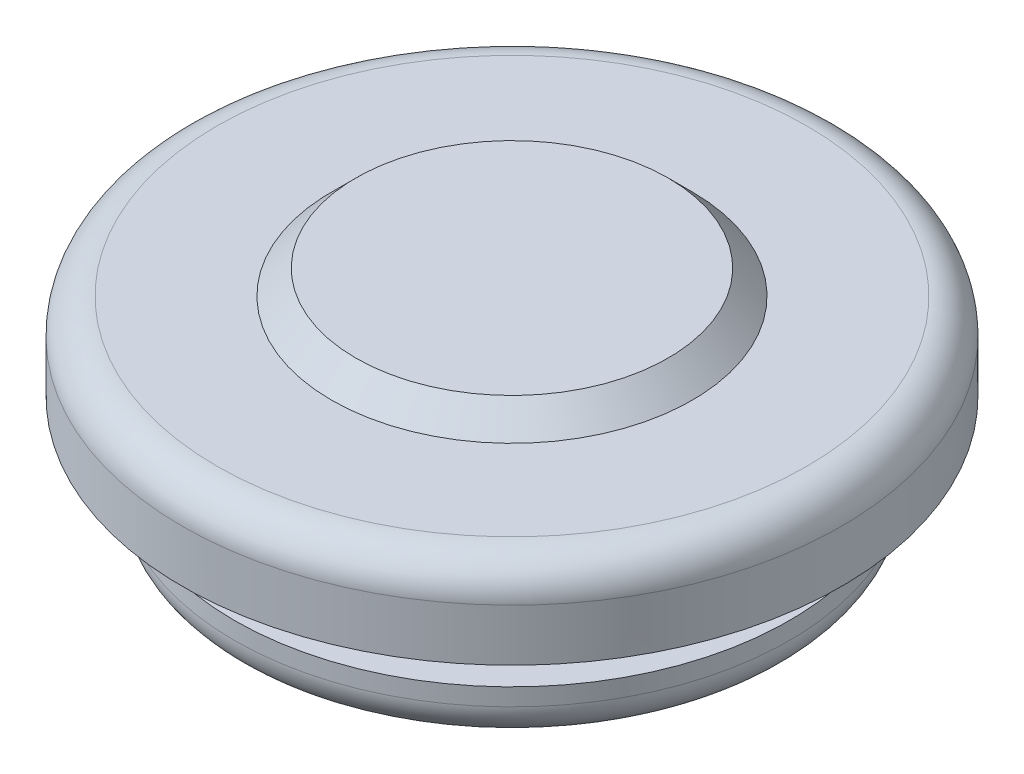
ISO-10303-21;
HEADER;
FILE_DESCRIPTION(('STEP AP214'),'2;1');
FILE_NAME('part.step','',(''),(''),'','','');
FILE_SCHEMA(('AUTOMOTIVE_DESIGN { 1 0 10303 214 1 1 1 1 }'));
ENDSEC;
DATA;
#1=APPLICATION_CONTEXT('core data for automotive mechanical design processes');
#2=APPLICATION_PROTOCOL_DEFINITION('international standard','automotive_design',2000,#1);
#3=PRODUCT_CONTEXT('',#1,'mechanical');
#4=PRODUCT('Part','Part','',(#3));
#5=PRODUCT_RELATED_PRODUCT_CATEGORY('part','',(#4));
#6=PRODUCT_DEFINITION_FORMATION('','',#4);
#7=PRODUCT_DEFINITION_CONTEXT('part definition',#1,'design');
#8=PRODUCT_DEFINITION('design','',#6,#7);
#9=PRODUCT_DEFINITION_SHAPE('','',#8);
#10=(LENGTH_UNIT() NAMED_UNIT(*) SI_UNIT(.MILLI.,.METRE.));
#11=(NAMED_UNIT(*) PLANE_ANGLE_UNIT() SI_UNIT($,.RADIAN.));
#12=(NAMED_UNIT(*) SI_UNIT($,.STERADIAN.) SOLID_ANGLE_UNIT());
#13=UNCERTAINTY_MEASURE_WITH_UNIT(LENGTH_MEASURE(1.E-05),#10,'distance_accuracy_value','');
#14=(GEOMETRIC_REPRESENTATION_CONTEXT(3) GLOBAL_UNCERTAINTY_ASSIGNED_CONTEXT((#13)) GLOBAL_UNIT_ASSIGNED_CONTEXT((#10,
#11,#12)) REPRESENTATION_CONTEXT('',''));
#15=CARTESIAN_POINT('',(0.,0.,0.));
#16=DIRECTION('',(0.,0.,1.));
#17=DIRECTION('',(1.,0.,0.));
#18=AXIS2_PLACEMENT_3D('',#15,#16,#17);
#19=CARTESIAN_POINT('',(0.,5.6,0.));
#20=DIRECTION('',(0.,-1.,0.));
#21=DIRECTION('',(0.,0.,-1.));
#22=AXIS2_PLACEMENT_3D('',#19,#20,#21);
#23=PLANE('',#22);
#24=CARTESIAN_POINT('',(0.,5.6,0.));
#25=DIRECTION('',(0.,-1.,0.));
#26=DIRECTION('',(0.,0.,-1.));
#27=AXIS2_PLACEMENT_3D('',#24,#25,#26);
#28=CIRCLE('',#27,3.5);
#29=CARTESIAN_POINT('',(0.,5.6,-3.5));
#30=VERTEX_POINT('',#29);
#31=EDGE_CURVE('E54',#30,#30,#28,.T.);
#32=ORIENTED_EDGE('',*,*,#31,.T.);
#33=EDGE_LOOP('',(#32));
#34=FACE_BOUND('',#33,.T.);
#35=ADVANCED_FACE('F31',(#34),#23,.T.);
#36=CARTESIAN_POINT('',(0.,0.,0.));
#37=DIRECTION('',(0.,-1.,0.));
#38=DIRECTION('',(0.,0.,-1.));
#39=AXIS2_PLACEMENT_3D('',#36,#37,#38);
#40=CYLINDRICAL_SURFACE('',#39,3.5);
#41=CARTESIAN_POINT('',(0.,0.,0.));
#42=DIRECTION('',(0.,-1.,0.));
#43=DIRECTION('',(0.,0.,-1.));
#44=AXIS2_PLACEMENT_3D('',#41,#42,#43);
#45=CIRCLE('',#44,3.5);
#46=CARTESIAN_POINT('',(0.,0.,-3.5));
#47=VERTEX_POINT('',#46);
#48=EDGE_CURVE('E57',#47,#47,#45,.T.);
#49=ORIENTED_EDGE('',*,*,#48,.T.);
#50=EDGE_LOOP('',(#49));
#51=FACE_BOUND('',#50,.T.);
#52=ORIENTED_EDGE('',*,*,#31,.F.);
#53=EDGE_LOOP('',(#52));
#54=FACE_BOUND('',#53,.T.);
#55=ADVANCED_FACE('F93',(#51,#54),#40,.F.);
#56=CARTESIAN_POINT('',(3.5,0.,0.));
#57=DIRECTION('',(0.,-1.,0.));
#58=DIRECTION('',(0.,0.,-1.));
#59=AXIS2_PLACEMENT_3D('',#56,#57,#58);
#60=PLANE('',#59);
#61=CARTESIAN_POINT('',(0.,0.,0.));
#62=DIRECTION('',(0.,-1.,0.));
#63=DIRECTION('',(0.,0.,-1.));
#64=AXIS2_PLACEMENT_3D('',#61,#62,#63);
#65=CIRCLE('',#64,7.);
#66=CARTESIAN_POINT('',(0.,0.,-7.));
#67=VERTEX_POINT('',#66);
#68=EDGE_CURVE('E51',#67,#67,#65,.T.);
#69=ORIENTED_EDGE('',*,*,#68,.T.);
#70=EDGE_LOOP('',(#69));
#71=FACE_BOUND('',#70,.T.);
#72=ORIENTED_EDGE('',*,*,#48,.F.);
#73=EDGE_LOOP('',(#72));
#74=FACE_BOUND('',#73,.T.);
#75=ADVANCED_FACE('F99',(#71,#74),#60,.T.);
#76=CARTESIAN_POINT('',(0.,0.,0.));
#77=DIRECTION('',(0.,-1.,0.));
#78=DIRECTION('',(0.,0.,-1.));
#79=AXIS2_PLACEMENT_3D('',#76,#77,#78);
#80=CYLINDRICAL_SURFACE('',#79,8.);
#81=CARTESIAN_POINT('',(0.,1.,0.));
#82=DIRECTION('',(0.,-1.,0.));
#83=DIRECTION('',(0.,0.,-1.));
#84=AXIS2_PLACEMENT_3D('',#81,#82,#83);
#85=CIRCLE('',#84,8.);
#86=CARTESIAN_POINT('',(0.,1.,-8.));
#87=VERTEX_POINT('',#86);
#88=EDGE_CURVE('E46',#87,#87,#85,.F.);
#89=ORIENTED_EDGE('',*,*,#88,.T.);
#90=EDGE_LOOP('',(#89));
#91=FACE_BOUND('',#90,.T.);
#92=CARTESIAN_POINT('',(0.,1.5,0.));
#93=DIRECTION('',(0.,-1.,0.));
#94=DIRECTION('',(0.,0.,-1.));
#95=AXIS2_PLACEMENT_3D('',#92,#93,#94);
#96=CIRCLE('',#95,8.);
#97=CARTESIAN_POINT('',(0.,1.5,-8.));
#98=VERTEX_POINT('',#97);
#99=EDGE_CURVE('E60',#98,#98,#96,.T.);
#100=ORIENTED_EDGE('',*,*,#99,.T.);
#101=EDGE_LOOP('',(#100));
#102=FACE_BOUND('',#101,.T.);
#103=ADVANCED_FACE('F131',(#91,#102),#80,.T.);
#104=CARTESIAN_POINT('',(8.,1.5,0.));
#105=DIRECTION('',(0.,1.,0.));
#106=DIRECTION('',(0.,0.,1.));
#107=AXIS2_PLACEMENT_3D('',#104,#105,#106);
#108=PLANE('',#107);
#109=CARTESIAN_POINT('',(0.,1.5,0.));
#110=DIRECTION('',(0.,-1.,0.));
#111=DIRECTION('',(0.,0.,-1.));
#112=AXIS2_PLACEMENT_3D('',#109,#110,#111);
#113=CIRCLE('',#112,6.);
#114=CARTESIAN_POINT('',(0.,1.5,-6.));
#115=VERTEX_POINT('',#114);
#116=EDGE_CURVE('E63',#115,#115,#113,.T.);
#117=ORIENTED_EDGE('',*,*,#116,.T.);
#118=EDGE_LOOP('',(#117));
#119=FACE_BOUND('',#118,.T.);
#120=ORIENTED_EDGE('',*,*,#99,.F.);
#121=EDGE_LOOP('',(#120));
#122=FACE_BOUND('',#121,.T.);
#123=ADVANCED_FACE('F125',(#119,#122),#108,.T.);
#124=CARTESIAN_POINT('',(0.,0.,0.));
#125=DIRECTION('',(0.,-1.,0.));
#126=DIRECTION('',(0.,0.,-1.));
#127=AXIS2_PLACEMENT_3D('',#124,#125,#126);
#128=CYLINDRICAL_SURFACE('',#127,6.);
#129=CARTESIAN_POINT('',(0.,3.1,0.));
#130=DIRECTION('',(0.,-1.,0.));
#131=DIRECTION('',(0.,0.,-1.));
#132=AXIS2_PLACEMENT_3D('',#129,#130,#131);
#133=CIRCLE('',#132,6.);
#134=CARTESIAN_POINT('',(0.,3.1,-6.));
#135=VERTEX_POINT('',#134);
#136=EDGE_CURVE('E66',#135,#135,#133,.T.);
#137=ORIENTED_EDGE('',*,*,#136,.T.);
#138=EDGE_LOOP('',(#137));
#139=FACE_BOUND('',#138,.T.);
#140=ORIENTED_EDGE('',*,*,#116,.F.);
#141=EDGE_LOOP('',(#140));
#142=FACE_BOUND('',#141,.T.);
#143=ADVANCED_FACE('F119',(#139,#142),#128,.T.);
#144=CARTESIAN_POINT('',(9.5,3.1,0.));
#145=DIRECTION('',(0.,-1.,0.));
#146=DIRECTION('',(0.,0.,-1.));
#147=AXIS2_PLACEMENT_3D('',#144,#145,#146);
#148=PLANE('',#147);
#149=CARTESIAN_POINT('',(0.,3.1,0.));
#150=DIRECTION('',(0.,-1.,0.));
#151=DIRECTION('',(0.,0.,-1.));
#152=AXIS2_PLACEMENT_3D('',#149,#150,#151);
#153=CIRCLE('',#152,9.5);
#154=CARTESIAN_POINT('',(0.,3.1,-9.5));
#155=VERTEX_POINT('',#154);
#156=EDGE_CURVE('E69',#155,#155,#153,.T.);
#157=ORIENTED_EDGE('',*,*,#156,.T.);
#158=EDGE_LOOP('',(#157));
#159=FACE_BOUND('',#158,.T.);
#160=ORIENTED_EDGE('',*,*,#136,.F.);
#161=EDGE_LOOP('',(#160));
#162=FACE_BOUND('',#161,.T.);
#163=ADVANCED_FACE('F113',(#159,#162),#148,.T.);
#164=CARTESIAN_POINT('',(0.,0.,0.));
#165=DIRECTION('',(0.,-1.,0.));
#166=DIRECTION('',(0.,0.,-1.));
#167=AXIS2_PLACEMENT_3D('',#164,#165,#166);
#168=CYLINDRICAL_SURFACE('',#167,9.5);
#169=CARTESIAN_POINT('',(0.,4.6,0.));
#170=DIRECTION('',(0.,1.,0.));
#171=DIRECTION('',(0.,0.,1.));
#172=AXIS2_PLACEMENT_3D('',#169,#170,#171);
#173=CIRCLE('',#172,9.5);
#174=CARTESIAN_POINT('',(0.,4.6,9.5));
#175=VERTEX_POINT('',#174);
#176=EDGE_CURVE('E42',#175,#175,#173,.F.);
#177=ORIENTED_EDGE('',*,*,#176,.T.);
#178=EDGE_LOOP('',(#177));
#179=FACE_BOUND('',#178,.T.);
#180=ORIENTED_EDGE('',*,*,#156,.F.);
#181=EDGE_LOOP('',(#180));
#182=FACE_BOUND('',#181,.T.);
#183=ADVANCED_FACE('F90',(#179,#182),#168,.T.);
#184=CARTESIAN_POINT('',(9.5,5.6,0.));
#185=DIRECTION('',(0.,1.,0.));
#186=DIRECTION('',(0.,0.,1.));
#187=AXIS2_PLACEMENT_3D('',#184,#185,#186);
#188=PLANE('',#187);
#189=CARTESIAN_POINT('',(0.,5.6,0.));
#190=DIRECTION('',(0.,1.,0.));
#191=DIRECTION('',(0.,0.,1.));
#192=AXIS2_PLACEMENT_3D('',#189,#190,#191);
#193=CIRCLE('',#192,5.20000000000001);
#194=CARTESIAN_POINT('',(0.,5.6,5.20000000000001));
#195=VERTEX_POINT('',#194);
#196=EDGE_CURVE('E10',#195,#195,#193,.F.);
#197=ORIENTED_EDGE('',*,*,#196,.T.);
#198=EDGE_LOOP('',(#197));
#199=FACE_BOUND('',#198,.T.);
#200=CARTESIAN_POINT('',(0.,5.6,0.));
#201=DIRECTION('',(0.,1.,0.));
#202=DIRECTION('',(0.,0.,1.));
#203=AXIS2_PLACEMENT_3D('',#200,#201,#202);
#204=CIRCLE('',#203,8.5);
#205=CARTESIAN_POINT('',(0.,5.6,8.5));
#206=VERTEX_POINT('',#205);
#207=EDGE_CURVE('E38',#206,#206,#204,.T.);
#208=ORIENTED_EDGE('',*,*,#207,.T.);
#209=EDGE_LOOP('',(#208));
#210=FACE_BOUND('',#209,.T.);
#211=ADVANCED_FACE('F81',(#199,#210),#188,.T.);
#212=CARTESIAN_POINT('',(0.,6.3,0.));
#213=DIRECTION('',(0.,1.,0.));
#214=DIRECTION('',(0.,0.,1.));
#215=AXIS2_PLACEMENT_3D('',#212,#213,#214);
#216=PLANE('',#215);
#217=CARTESIAN_POINT('',(0.,6.3,0.));
#218=DIRECTION('',(0.,-1.,0.));
#219=DIRECTION('',(0.,0.,-1.));
#220=AXIS2_PLACEMENT_3D('',#217,#218,#219);
#221=CIRCLE('',#220,4.5);
#222=CARTESIAN_POINT('',(0.,6.3,-4.5));
#223=VERTEX_POINT('',#222);
#224=EDGE_CURVE('E72',#223,#223,#221,.T.);
#225=ORIENTED_EDGE('',*,*,#224,.F.);
#226=EDGE_LOOP('',(#225));
#227=FACE_BOUND('',#226,.T.);
#228=ADVANCED_FACE('F78',(#227),#216,.T.);
#229=CARTESIAN_POINT('',(0.,1.,0.));
#230=DIRECTION('',(0.,-1.,0.));
#231=DIRECTION('',(0.,0.,-1.));
#232=AXIS2_PLACEMENT_3D('',#229,#230,#231);
#233=TOROIDAL_SURFACE('',#232,7.,1.);
#234=ORIENTED_EDGE('',*,*,#88,.F.);
#235=EDGE_LOOP('',(#234));
#236=FACE_BOUND('',#235,.T.);
#237=ORIENTED_EDGE('',*,*,#68,.F.);
#238=EDGE_LOOP('',(#237));
#239=FACE_BOUND('',#238,.T.);
#240=ADVANCED_FACE('F80',(#236,#239),#233,.T.);
#241=CARTESIAN_POINT('',(0.,4.6,0.));
#242=DIRECTION('',(0.,1.,0.));
#243=DIRECTION('',(0.,0.,1.));
#244=AXIS2_PLACEMENT_3D('',#241,#242,#243);
#245=TOROIDAL_SURFACE('',#244,8.5,1.);
#246=ORIENTED_EDGE('',*,*,#207,.F.);
#247=EDGE_LOOP('',(#246));
#248=FACE_BOUND('',#247,.T.);
#249=ORIENTED_EDGE('',*,*,#176,.F.);
#250=EDGE_LOOP('',(#249));
#251=FACE_BOUND('',#250,.T.);
#252=ADVANCED_FACE('F87',(#248,#251),#245,.T.);
#253=CARTESIAN_POINT('',(0.,5.6,0.));
#254=DIRECTION('',(0.,-1.,0.));
#255=DIRECTION('',(0.,0.,-1.));
#256=AXIS2_PLACEMENT_3D('',#253,#254,#255);
#257=CONICAL_SURFACE('',#256,5.20000000000001,0.785398163397454);
#258=ORIENTED_EDGE('',*,*,#224,.T.);
#259=EDGE_LOOP('',(#258));
#260=FACE_BOUND('',#259,.T.);
#261=ORIENTED_EDGE('',*,*,#196,.F.);
#262=EDGE_LOOP('',(#261));
#263=FACE_BOUND('',#262,.T.);
#264=ADVANCED_FACE('F33',(#260,#263),#257,.T.);
#265=CLOSED_SHELL('',(#35,#55,#75,#103,#123,#143,#163,#183,#211,#228,#240,#252,#264));
#266=MANIFOLD_SOLID_BREP('B2',#265);
#267=ADVANCED_BREP_SHAPE_REPRESENTATION('',(#18,#266),#14);
#268=SHAPE_DEFINITION_REPRESENTATION(#9,#267);
ENDSEC;
END-ISO-10303-21;
